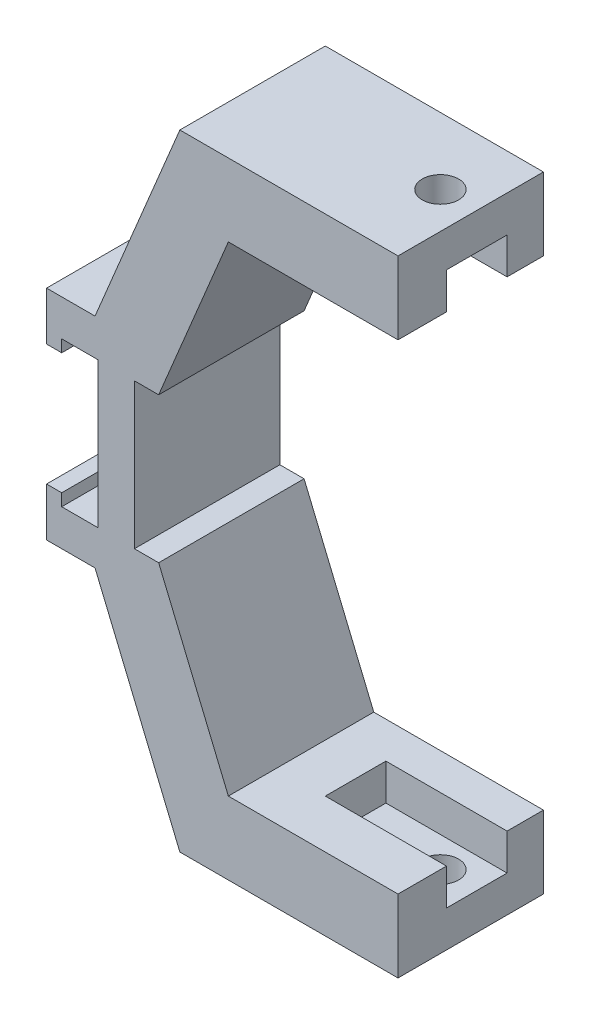
ISO-10303-21;
HEADER;
FILE_DESCRIPTION(('STEP AP214'),'2;1');
FILE_NAME('part.step','',(''),(''),'','','');
FILE_SCHEMA(('AUTOMOTIVE_DESIGN { 1 0 10303 214 1 1 1 1 }'));
ENDSEC;
DATA;
#1=APPLICATION_CONTEXT('core data for automotive mechanical design processes');
#2=APPLICATION_PROTOCOL_DEFINITION('international standard','automotive_design',2000,#1);
#3=PRODUCT_CONTEXT('',#1,'mechanical');
#4=PRODUCT('Part','Part','',(#3));
#5=PRODUCT_RELATED_PRODUCT_CATEGORY('part','',(#4));
#6=PRODUCT_DEFINITION_FORMATION('','',#4);
#7=PRODUCT_DEFINITION_CONTEXT('part definition',#1,'design');
#8=PRODUCT_DEFINITION('design','',#6,#7);
#9=PRODUCT_DEFINITION_SHAPE('','',#8);
#10=(LENGTH_UNIT() NAMED_UNIT(*) SI_UNIT(.MILLI.,.METRE.));
#11=(NAMED_UNIT(*) PLANE_ANGLE_UNIT() SI_UNIT($,.RADIAN.));
#12=(NAMED_UNIT(*) SI_UNIT($,.STERADIAN.) SOLID_ANGLE_UNIT());
#13=UNCERTAINTY_MEASURE_WITH_UNIT(LENGTH_MEASURE(1.E-05),#10,'distance_accuracy_value','');
#14=(GEOMETRIC_REPRESENTATION_CONTEXT(3) GLOBAL_UNCERTAINTY_ASSIGNED_CONTEXT((#13)) GLOBAL_UNIT_ASSIGNED_CONTEXT((#10,
#11,#12)) REPRESENTATION_CONTEXT('',''));
#15=CARTESIAN_POINT('',(0.,0.,0.));
#16=DIRECTION('',(0.,0.,1.));
#17=DIRECTION('',(1.,0.,0.));
#18=AXIS2_PLACEMENT_3D('',#15,#16,#17);
#19=CARTESIAN_POINT('',(8.96410514513844,-42.2697338281613,12.));
#20=DIRECTION('',(1.,0.,0.));
#21=DIRECTION('',(0.,0.,-1.));
#22=AXIS2_PLACEMENT_3D('',#19,#20,#21);
#23=PLANE('',#22);
#24=DIRECTION('',(0.,0.,1.));
#25=VECTOR('',#24,1.);
#26=CARTESIAN_POINT('',(8.96410514513844,-39.2697338281613,8.));
#27=LINE('',#26,#25);
#28=CARTESIAN_POINT('',(8.96410514513844,-39.2697338281613,3.));
#29=VERTEX_POINT('',#28);
#30=CARTESIAN_POINT('',(8.96410514513844,-39.2697338281613,8.));
#31=VERTEX_POINT('',#30);
#32=EDGE_CURVE('E267',#29,#31,#27,.T.);
#33=ORIENTED_EDGE('',*,*,#32,.T.);
#34=DIRECTION('',(0.,1.,0.));
#35=VECTOR('',#34,1.);
#36=CARTESIAN_POINT('',(8.96410514513844,-39.2697338281613,8.));
#37=LINE('',#36,#35);
#38=CARTESIAN_POINT('',(8.96410514513844,-36.2697338281613,8.));
#39=VERTEX_POINT('',#38);
#40=EDGE_CURVE('E258',#31,#39,#37,.T.);
#41=ORIENTED_EDGE('',*,*,#40,.T.);
#42=DIRECTION('',(0.,0.,-1.));
#43=VECTOR('',#42,1.);
#44=CARTESIAN_POINT('',(8.96410514513844,-36.2697338281613,12.));
#45=LINE('',#44,#43);
#46=CARTESIAN_POINT('',(8.96410514513844,-36.2697338281613,12.));
#47=VERTEX_POINT('',#46);
#48=EDGE_CURVE('E374',#47,#39,#45,.T.);
#49=ORIENTED_EDGE('',*,*,#48,.F.);
#50=DIRECTION('',(0.,-1.,0.));
#51=VECTOR('',#50,1.);
#52=CARTESIAN_POINT('',(8.96410514513844,-42.2697338281613,12.));
#53=LINE('',#52,#51);
#54=CARTESIAN_POINT('',(8.96410514513844,-42.2697338281613,12.));
#55=VERTEX_POINT('',#54);
#56=EDGE_CURVE('E284',#47,#55,#53,.T.);
#57=ORIENTED_EDGE('',*,*,#56,.T.);
#58=DIRECTION('',(0.,0.,-1.));
#59=VECTOR('',#58,1.);
#60=CARTESIAN_POINT('',(8.96410514513844,-42.2697338281613,12.));
#61=LINE('',#60,#59);
#62=CARTESIAN_POINT('',(8.96410514513844,-42.2697338281613,0.));
#63=VERTEX_POINT('',#62);
#64=EDGE_CURVE('E318',#55,#63,#61,.T.);
#65=ORIENTED_EDGE('',*,*,#64,.T.);
#66=DIRECTION('',(0.,-1.,0.));
#67=VECTOR('',#66,1.);
#68=CARTESIAN_POINT('',(8.96410514513844,-42.2697338281613,0.));
#69=LINE('',#68,#67);
#70=CARTESIAN_POINT('',(8.96410514513844,-36.2697338281613,0.));
#71=VERTEX_POINT('',#70);
#72=EDGE_CURVE('E279',#71,#63,#69,.T.);
#73=ORIENTED_EDGE('',*,*,#72,.F.);
#74=CARTESIAN_POINT('',(8.96410514513844,-36.2697338281613,3.));
#75=VERTEX_POINT('',#74);
#76=EDGE_CURVE('E373',#75,#71,#45,.T.);
#77=ORIENTED_EDGE('',*,*,#76,.F.);
#78=DIRECTION('',(0.,-1.,0.));
#79=VECTOR('',#78,1.);
#80=CARTESIAN_POINT('',(8.96410514513844,-39.2697338281613,3.));
#81=LINE('',#80,#79);
#82=EDGE_CURVE('E264',#75,#29,#81,.T.);
#83=ORIENTED_EDGE('',*,*,#82,.T.);
#84=EDGE_LOOP('',(#33,#41,#49,#57,#65,#73,#77,#83));
#85=FACE_BOUND('',#84,.T.);
#86=ADVANCED_FACE('F33',(#85),#23,.T.);
#87=CARTESIAN_POINT('',(8.96410514513844,-36.2697338281613,12.));
#88=DIRECTION('',(0.,1.,0.));
#89=DIRECTION('',(-1.,0.,0.));
#90=AXIS2_PLACEMENT_3D('',#87,#88,#89);
#91=PLANE('',#90);
#92=ORIENTED_EDGE('',*,*,#48,.T.);
#93=DIRECTION('',(1.,0.,0.));
#94=VECTOR('',#93,1.);
#95=CARTESIAN_POINT('',(-1.03589485486156,-36.2697338281613,8.));
#96=LINE('',#95,#94);
#97=CARTESIAN_POINT('',(-1.03589485486156,-36.2697338281613,8.));
#98=VERTEX_POINT('',#97);
#99=EDGE_CURVE('E277',#98,#39,#96,.T.);
#100=ORIENTED_EDGE('',*,*,#99,.F.);
#101=DIRECTION('',(0.,0.,-1.));
#102=VECTOR('',#101,1.);
#103=CARTESIAN_POINT('',(-1.03589485486156,-36.2697338281613,8.));
#104=LINE('',#103,#102);
#105=CARTESIAN_POINT('',(-1.03589485486156,-36.2697338281613,3.));
#106=VERTEX_POINT('',#105);
#107=EDGE_CURVE('E260',#98,#106,#104,.T.);
#108=ORIENTED_EDGE('',*,*,#107,.T.);
#109=DIRECTION('',(1.,0.,0.));
#110=VECTOR('',#109,1.);
#111=CARTESIAN_POINT('',(-1.03589485486156,-36.2697338281613,3.));
#112=LINE('',#111,#110);
#113=EDGE_CURVE('E280',#106,#75,#112,.T.);
#114=ORIENTED_EDGE('',*,*,#113,.T.);
#115=ORIENTED_EDGE('',*,*,#76,.T.);
#116=DIRECTION('',(1.,0.,0.));
#117=VECTOR('',#116,1.);
#118=CARTESIAN_POINT('',(8.96410514513844,-36.2697338281613,0.));
#119=LINE('',#118,#117);
#120=CARTESIAN_POINT('',(-5.03589485486156,-36.2697338281613,0.));
#121=VERTEX_POINT('',#120);
#122=EDGE_CURVE('E321',#121,#71,#119,.T.);
#123=ORIENTED_EDGE('',*,*,#122,.F.);
#124=DIRECTION('',(0.,0.,-1.));
#125=VECTOR('',#124,1.);
#126=CARTESIAN_POINT('',(-5.03589485486156,-36.2697338281613,12.));
#127=LINE('',#126,#125);
#128=CARTESIAN_POINT('',(-5.03589485486156,-36.2697338281613,12.));
#129=VERTEX_POINT('',#128);
#130=EDGE_CURVE('E371',#129,#121,#127,.T.);
#131=ORIENTED_EDGE('',*,*,#130,.F.);
#132=DIRECTION('',(1.,0.,0.));
#133=VECTOR('',#132,1.);
#134=CARTESIAN_POINT('',(8.96410514513844,-36.2697338281613,12.));
#135=LINE('',#134,#133);
#136=EDGE_CURVE('E287',#129,#47,#135,.T.);
#137=ORIENTED_EDGE('',*,*,#136,.T.);
#138=EDGE_LOOP('',(#92,#100,#108,#114,#115,#123,#131,#137));
#139=FACE_BOUND('',#138,.T.);
#140=ADVANCED_FACE('F558',(#139),#91,.T.);
#141=CARTESIAN_POINT('',(8.96410514513844,9.33026617183856,12.));
#142=DIRECTION('',(-1.,0.,0.));
#143=DIRECTION('',(0.,0.,1.));
#144=AXIS2_PLACEMENT_3D('',#141,#142,#143);
#145=PLANE('',#144);
#146=DIRECTION('',(0.,0.,-1.));
#147=VECTOR('',#146,1.);
#148=CARTESIAN_POINT('',(8.96410514513844,3.33026617183856,12.));
#149=LINE('',#148,#147);
#150=CARTESIAN_POINT('',(8.96410514513844,3.33026617183856,12.));
#151=VERTEX_POINT('',#150);
#152=CARTESIAN_POINT('',(8.96410514513844,3.33026617183858,8.));
#153=VERTEX_POINT('',#152);
#154=EDGE_CURVE('E464',#151,#153,#149,.T.);
#155=ORIENTED_EDGE('',*,*,#154,.T.);
#156=DIRECTION('',(0.,-1.,0.));
#157=VECTOR('',#156,1.);
#158=CARTESIAN_POINT('',(8.96410514513844,6.33026617183858,8.));
#159=LINE('',#158,#157);
#160=CARTESIAN_POINT('',(8.96410514513844,6.33026617183858,8.));
#161=VERTEX_POINT('',#160);
#162=EDGE_CURVE('E383',#161,#153,#159,.T.);
#163=ORIENTED_EDGE('',*,*,#162,.F.);
#164=DIRECTION('',(0.,0.,1.));
#165=VECTOR('',#164,1.);
#166=CARTESIAN_POINT('',(8.96410514513844,6.33026617183858,8.));
#167=LINE('',#166,#165);
#168=CARTESIAN_POINT('',(8.96410514513844,6.33026617183858,3.));
#169=VERTEX_POINT('',#168);
#170=EDGE_CURVE('E386',#169,#161,#167,.T.);
#171=ORIENTED_EDGE('',*,*,#170,.F.);
#172=DIRECTION('',(0.,1.,0.));
#173=VECTOR('',#172,1.);
#174=CARTESIAN_POINT('',(8.96410514513844,6.33026617183858,3.));
#175=LINE('',#174,#173);
#176=CARTESIAN_POINT('',(8.96410514513844,3.33026617183858,3.));
#177=VERTEX_POINT('',#176);
#178=EDGE_CURVE('E395',#177,#169,#175,.T.);
#179=ORIENTED_EDGE('',*,*,#178,.F.);
#180=CARTESIAN_POINT('',(8.96410514513844,3.33026617183856,0.));
#181=VERTEX_POINT('',#180);
#182=EDGE_CURVE('E437',#177,#181,#149,.T.);
#183=ORIENTED_EDGE('',*,*,#182,.T.);
#184=DIRECTION('',(0.,1.,0.));
#185=VECTOR('',#184,1.);
#186=CARTESIAN_POINT('',(8.96410514513844,9.33026617183856,0.));
#187=LINE('',#186,#185);
#188=CARTESIAN_POINT('',(8.96410514513844,9.33026617183856,0.));
#189=VERTEX_POINT('',#188);
#190=EDGE_CURVE('E402',#181,#189,#187,.T.);
#191=ORIENTED_EDGE('',*,*,#190,.T.);
#192=DIRECTION('',(0.,0.,-1.));
#193=VECTOR('',#192,1.);
#194=CARTESIAN_POINT('',(8.96410514513844,9.33026617183856,12.));
#195=LINE('',#194,#193);
#196=CARTESIAN_POINT('',(8.96410514513844,9.33026617183856,12.));
#197=VERTEX_POINT('',#196);
#198=EDGE_CURVE('E11',#197,#189,#195,.T.);
#199=ORIENTED_EDGE('',*,*,#198,.F.);
#200=DIRECTION('',(0.,1.,0.));
#201=VECTOR('',#200,1.);
#202=CARTESIAN_POINT('',(8.96410514513844,9.33026617183856,12.));
#203=LINE('',#202,#201);
#204=EDGE_CURVE('E409',#151,#197,#203,.T.);
#205=ORIENTED_EDGE('',*,*,#204,.F.);
#206=EDGE_LOOP('',(#155,#163,#171,#179,#183,#191,#199,#205));
#207=FACE_BOUND('',#206,.T.);
#208=ADVANCED_FACE('F35',(#207),#145,.F.);
#209=CARTESIAN_POINT('',(8.96410514513844,9.33026617183856,12.));
#210=DIRECTION('',(0.,-1.,0.));
#211=DIRECTION('',(0.,0.,-1.));
#212=AXIS2_PLACEMENT_3D('',#209,#210,#211);
#213=PLANE('',#212);
#214=CARTESIAN_POINT('',(5.96410514513844,9.33026617183856,5.5));
#215=DIRECTION('',(0.,1.,0.));
#216=DIRECTION('',(-1.,0.,0.));
#217=AXIS2_PLACEMENT_3D('',#214,#215,#216);
#218=CIRCLE('',#217,1.5);
#219=CARTESIAN_POINT('',(4.46410514513844,9.33026617183856,5.5));
#220=VERTEX_POINT('',#219);
#221=EDGE_CURVE('E377',#220,#220,#218,.T.);
#222=ORIENTED_EDGE('',*,*,#221,.F.);
#223=EDGE_LOOP('',(#222));
#224=FACE_BOUND('',#223,.T.);
#225=DIRECTION('',(-1.,0.,0.));
#226=VECTOR('',#225,1.);
#227=CARTESIAN_POINT('',(8.96410514513844,9.33026617183856,0.));
#228=LINE('',#227,#226);
#229=CARTESIAN_POINT('',(-9.03589485486156,9.33026617183856,0.));
#230=VERTEX_POINT('',#229);
#231=EDGE_CURVE('E440',#189,#230,#228,.T.);
#232=ORIENTED_EDGE('',*,*,#231,.T.);
#233=DIRECTION('',(0.,0.,-1.));
#234=VECTOR('',#233,1.);
#235=CARTESIAN_POINT('',(-9.03589485486156,9.33026617183856,12.));
#236=LINE('',#235,#234);
#237=CARTESIAN_POINT('',(-9.03589485486156,9.33026617183856,12.));
#238=VERTEX_POINT('',#237);
#239=EDGE_CURVE('E41',#238,#230,#236,.T.);
#240=ORIENTED_EDGE('',*,*,#239,.F.);
#241=DIRECTION('',(-1.,0.,0.));
#242=VECTOR('',#241,1.);
#243=CARTESIAN_POINT('',(8.96410514513844,9.33026617183856,12.));
#244=LINE('',#243,#242);
#245=EDGE_CURVE('E412',#197,#238,#244,.T.);
#246=ORIENTED_EDGE('',*,*,#245,.F.);
#247=ORIENTED_EDGE('',*,*,#198,.T.);
#248=EDGE_LOOP('',(#232,#240,#246,#247));
#249=FACE_BOUND('',#248,.T.);
#250=ADVANCED_FACE('F521',(#224,#249),#213,.F.);
#251=CARTESIAN_POINT('',(-9.03589485486156,9.33026617183856,12.));
#252=DIRECTION('',(0.923076923076922,-0.384615384615386,0.));
#253=DIRECTION('',(0.384615384615386,0.923076923076923,0.));
#254=AXIS2_PLACEMENT_3D('',#251,#252,#253);
#255=PLANE('',#254);
#256=DIRECTION('',(-0.384615384615386,-0.923076923076923,0.));
#257=VECTOR('',#256,1.);
#258=CARTESIAN_POINT('',(-9.03589485486156,9.33026617183856,0.));
#259=LINE('',#258,#257);
#260=CARTESIAN_POINT('',(-16.0358948548616,-7.46973382816139,0.));
#261=VERTEX_POINT('',#260);
#262=EDGE_CURVE('E442',#230,#261,#259,.T.);
#263=ORIENTED_EDGE('',*,*,#262,.T.);
#264=DIRECTION('',(0.,0.,-1.));
#265=VECTOR('',#264,1.);
#266=CARTESIAN_POINT('',(-16.0358948548616,-7.46973382816139,12.));
#267=LINE('',#266,#265);
#268=CARTESIAN_POINT('',(-16.0358948548616,-7.46973382816139,12.));
#269=VERTEX_POINT('',#268);
#270=EDGE_CURVE('E491',#269,#261,#267,.T.);
#271=ORIENTED_EDGE('',*,*,#270,.F.);
#272=DIRECTION('',(-0.384615384615386,-0.923076923076923,0.));
#273=VECTOR('',#272,1.);
#274=CARTESIAN_POINT('',(-9.03589485486156,9.33026617183856,12.));
#275=LINE('',#274,#273);
#276=EDGE_CURVE('E415',#238,#269,#275,.T.);
#277=ORIENTED_EDGE('',*,*,#276,.F.);
#278=ORIENTED_EDGE('',*,*,#239,.T.);
#279=EDGE_LOOP('',(#263,#271,#277,#278));
#280=FACE_BOUND('',#279,.T.);
#281=ADVANCED_FACE('F498',(#280),#255,.F.);
#282=CARTESIAN_POINT('',(-16.0358948548616,-7.46973382816139,12.));
#283=DIRECTION('',(0.,-1.,0.));
#284=DIRECTION('',(1.,0.,0.));
#285=AXIS2_PLACEMENT_3D('',#282,#283,#284);
#286=PLANE('',#285);
#287=DIRECTION('',(-1.,0.,0.));
#288=VECTOR('',#287,1.);
#289=CARTESIAN_POINT('',(-16.0358948548616,-7.46973382816139,0.));
#290=LINE('',#289,#288);
#291=CARTESIAN_POINT('',(-20.0358948548616,-7.46973382816139,0.));
#292=VERTEX_POINT('',#291);
#293=EDGE_CURVE('E444',#261,#292,#290,.T.);
#294=ORIENTED_EDGE('',*,*,#293,.T.);
#295=DIRECTION('',(0.,0.,-1.));
#296=VECTOR('',#295,1.);
#297=CARTESIAN_POINT('',(-20.0358948548616,-7.46973382816139,12.));
#298=LINE('',#297,#296);
#299=CARTESIAN_POINT('',(-20.0358948548616,-7.46973382816139,12.));
#300=VERTEX_POINT('',#299);
#301=EDGE_CURVE('E488',#300,#292,#298,.T.);
#302=ORIENTED_EDGE('',*,*,#301,.F.);
#303=DIRECTION('',(-1.,0.,0.));
#304=VECTOR('',#303,1.);
#305=CARTESIAN_POINT('',(-16.0358948548616,-7.46973382816139,12.));
#306=LINE('',#305,#304);
#307=EDGE_CURVE('E417',#269,#300,#306,.T.);
#308=ORIENTED_EDGE('',*,*,#307,.F.);
#309=ORIENTED_EDGE('',*,*,#270,.T.);
#310=EDGE_LOOP('',(#294,#302,#308,#309));
#311=FACE_BOUND('',#310,.T.);
#312=ADVANCED_FACE('F509',(#311),#286,.F.);
#313=CARTESIAN_POINT('',(-20.0358948548616,-7.46973382816139,12.));
#314=DIRECTION('',(1.,0.,0.));
#315=DIRECTION('',(0.,0.,-1.));
#316=AXIS2_PLACEMENT_3D('',#313,#314,#315);
#317=PLANE('',#316);
#318=DIRECTION('',(0.,-1.,0.));
#319=VECTOR('',#318,1.);
#320=CARTESIAN_POINT('',(-20.0358948548616,-7.46973382816139,0.));
#321=LINE('',#320,#319);
#322=CARTESIAN_POINT('',(-20.0358948548616,-11.4697338281614,0.));
#323=VERTEX_POINT('',#322);
#324=EDGE_CURVE('E446',#292,#323,#321,.T.);
#325=ORIENTED_EDGE('',*,*,#324,.T.);
#326=DIRECTION('',(0.,0.,-1.));
#327=VECTOR('',#326,1.);
#328=CARTESIAN_POINT('',(-20.0358948548616,-11.4697338281614,12.));
#329=LINE('',#328,#327);
#330=CARTESIAN_POINT('',(-20.0358948548616,-11.4697338281614,12.));
#331=VERTEX_POINT('',#330);
#332=EDGE_CURVE('E485',#331,#323,#329,.T.);
#333=ORIENTED_EDGE('',*,*,#332,.F.);
#334=DIRECTION('',(0.,-1.,0.));
#335=VECTOR('',#334,1.);
#336=CARTESIAN_POINT('',(-20.0358948548616,-7.46973382816139,12.));
#337=LINE('',#336,#335);
#338=EDGE_CURVE('E419',#300,#331,#337,.T.);
#339=ORIENTED_EDGE('',*,*,#338,.F.);
#340=ORIENTED_EDGE('',*,*,#301,.T.);
#341=EDGE_LOOP('',(#325,#333,#339,#340));
#342=FACE_BOUND('',#341,.T.);
#343=ADVANCED_FACE('F513',(#342),#317,.F.);
#344=CARTESIAN_POINT('',(-20.0358948548616,-11.4697338281614,12.));
#345=DIRECTION('',(0.,1.,0.));
#346=DIRECTION('',(0.,0.,1.));
#347=AXIS2_PLACEMENT_3D('',#344,#345,#346);
#348=PLANE('',#347);
#349=DIRECTION('',(1.,0.,0.));
#350=VECTOR('',#349,1.);
#351=CARTESIAN_POINT('',(-20.0358948548616,-11.4697338281614,0.));
#352=LINE('',#351,#350);
#353=CARTESIAN_POINT('',(-18.7858948548615,-11.4697338281614,0.));
#354=VERTEX_POINT('',#353);
#355=EDGE_CURVE('E448',#323,#354,#352,.T.);
#356=ORIENTED_EDGE('',*,*,#355,.T.);
#357=DIRECTION('',(0.,0.,-1.));
#358=VECTOR('',#357,1.);
#359=CARTESIAN_POINT('',(-18.7858948548615,-11.4697338281614,12.));
#360=LINE('',#359,#358);
#361=CARTESIAN_POINT('',(-18.7858948548615,-11.4697338281614,12.));
#362=VERTEX_POINT('',#361);
#363=EDGE_CURVE('E482',#362,#354,#360,.T.);
#364=ORIENTED_EDGE('',*,*,#363,.F.);
#365=DIRECTION('',(1.,0.,0.));
#366=VECTOR('',#365,1.);
#367=CARTESIAN_POINT('',(-20.0358948548616,-11.4697338281614,12.));
#368=LINE('',#367,#366);
#369=EDGE_CURVE('E421',#331,#362,#368,.T.);
#370=ORIENTED_EDGE('',*,*,#369,.F.);
#371=ORIENTED_EDGE('',*,*,#332,.T.);
#372=EDGE_LOOP('',(#356,#364,#370,#371));
#373=FACE_BOUND('',#372,.T.);
#374=ADVANCED_FACE('F606',(#373),#348,.F.);
#375=CARTESIAN_POINT('',(-18.7858948548615,-11.4697338281614,12.));
#376=DIRECTION('',(-1.,0.,0.));
#377=DIRECTION('',(0.,-1.,0.));
#378=AXIS2_PLACEMENT_3D('',#375,#376,#377);
#379=PLANE('',#378);
#380=DIRECTION('',(0.,1.,0.));
#381=VECTOR('',#380,1.);
#382=CARTESIAN_POINT('',(-18.7858948548615,-11.4697338281614,0.));
#383=LINE('',#382,#381);
#384=CARTESIAN_POINT('',(-18.7858948548616,-10.4697338281614,0.));
#385=VERTEX_POINT('',#384);
#386=EDGE_CURVE('E450',#354,#385,#383,.T.);
#387=ORIENTED_EDGE('',*,*,#386,.T.);
#388=DIRECTION('',(0.,0.,-1.));
#389=VECTOR('',#388,1.);
#390=CARTESIAN_POINT('',(-18.7858948548616,-10.4697338281614,12.));
#391=LINE('',#390,#389);
#392=CARTESIAN_POINT('',(-18.7858948548616,-10.4697338281614,12.));
#393=VERTEX_POINT('',#392);
#394=EDGE_CURVE('E479',#393,#385,#391,.T.);
#395=ORIENTED_EDGE('',*,*,#394,.F.);
#396=DIRECTION('',(0.,1.,0.));
#397=VECTOR('',#396,1.);
#398=CARTESIAN_POINT('',(-18.7858948548615,-11.4697338281614,12.));
#399=LINE('',#398,#397);
#400=EDGE_CURVE('E423',#362,#393,#399,.T.);
#401=ORIENTED_EDGE('',*,*,#400,.F.);
#402=ORIENTED_EDGE('',*,*,#363,.T.);
#403=EDGE_LOOP('',(#387,#395,#401,#402));
#404=FACE_BOUND('',#403,.T.);
#405=ADVANCED_FACE('F604',(#404),#379,.F.);
#406=CARTESIAN_POINT('',(-18.7858948548616,-10.4697338281614,12.));
#407=DIRECTION('',(0.,1.,0.));
#408=DIRECTION('',(0.,0.,1.));
#409=AXIS2_PLACEMENT_3D('',#406,#407,#408);
#410=PLANE('',#409);
#411=DIRECTION('',(1.,0.,0.));
#412=VECTOR('',#411,1.);
#413=CARTESIAN_POINT('',(-18.7858948548616,-10.4697338281614,0.));
#414=LINE('',#413,#412);
#415=CARTESIAN_POINT('',(-15.7858948548616,-10.4697338281614,0.));
#416=VERTEX_POINT('',#415);
#417=EDGE_CURVE('E452',#385,#416,#414,.T.);
#418=ORIENTED_EDGE('',*,*,#417,.T.);
#419=DIRECTION('',(0.,0.,-1.));
#420=VECTOR('',#419,1.);
#421=CARTESIAN_POINT('',(-15.7858948548616,-10.4697338281614,12.));
#422=LINE('',#421,#420);
#423=CARTESIAN_POINT('',(-15.7858948548616,-10.4697338281614,12.));
#424=VERTEX_POINT('',#423);
#425=EDGE_CURVE('E476',#424,#416,#422,.T.);
#426=ORIENTED_EDGE('',*,*,#425,.F.);
#427=DIRECTION('',(1.,0.,0.));
#428=VECTOR('',#427,1.);
#429=CARTESIAN_POINT('',(-18.7858948548616,-10.4697338281614,12.));
#430=LINE('',#429,#428);
#431=EDGE_CURVE('E425',#393,#424,#430,.T.);
#432=ORIENTED_EDGE('',*,*,#431,.F.);
#433=ORIENTED_EDGE('',*,*,#394,.T.);
#434=EDGE_LOOP('',(#418,#426,#432,#433));
#435=FACE_BOUND('',#434,.T.);
#436=ADVANCED_FACE('F600',(#435),#410,.F.);
#437=CARTESIAN_POINT('',(-15.7858948548616,-10.4697338281614,12.));
#438=DIRECTION('',(1.,0.,0.));
#439=DIRECTION('',(0.,0.,-1.));
#440=AXIS2_PLACEMENT_3D('',#437,#438,#439);
#441=PLANE('',#440);
#442=DIRECTION('',(0.,-1.,0.));
#443=VECTOR('',#442,1.);
#444=CARTESIAN_POINT('',(-15.7858948548616,-10.4697338281614,0.));
#445=LINE('',#444,#443);
#446=CARTESIAN_POINT('',(-15.7858948548616,-22.4697338281614,0.));
#447=VERTEX_POINT('',#446);
#448=EDGE_CURVE('E454',#416,#447,#445,.T.);
#449=ORIENTED_EDGE('',*,*,#448,.T.);
#450=DIRECTION('',(0.,0.,-1.));
#451=VECTOR('',#450,1.);
#452=CARTESIAN_POINT('',(-15.7858948548616,-22.4697338281614,12.));
#453=LINE('',#452,#451);
#454=CARTESIAN_POINT('',(-15.7858948548616,-22.4697338281614,12.));
#455=VERTEX_POINT('',#454);
#456=EDGE_CURVE('E363',#455,#447,#453,.T.);
#457=ORIENTED_EDGE('',*,*,#456,.F.);
#458=DIRECTION('',(0.,-1.,0.));
#459=VECTOR('',#458,1.);
#460=CARTESIAN_POINT('',(-15.7858948548616,-10.4697338281614,12.));
#461=LINE('',#460,#459);
#462=EDGE_CURVE('E427',#424,#455,#461,.T.);
#463=ORIENTED_EDGE('',*,*,#462,.F.);
#464=ORIENTED_EDGE('',*,*,#425,.T.);
#465=EDGE_LOOP('',(#449,#457,#463,#464));
#466=FACE_BOUND('',#465,.T.);
#467=ADVANCED_FACE('F595',(#466),#441,.F.);
#468=CARTESIAN_POINT('',(-12.7858948548616,-10.4697338281614,12.));
#469=DIRECTION('',(-1.,0.,0.));
#470=DIRECTION('',(0.,0.,1.));
#471=AXIS2_PLACEMENT_3D('',#468,#469,#470);
#472=PLANE('',#471);
#473=DIRECTION('',(0.,1.,0.));
#474=VECTOR('',#473,1.);
#475=CARTESIAN_POINT('',(-12.7858948548616,-10.4697338281614,0.));
#476=LINE('',#475,#474);
#477=CARTESIAN_POINT('',(-12.7858948548616,-22.4697338281614,0.));
#478=VERTEX_POINT('',#477);
#479=CARTESIAN_POINT('',(-12.7858948548616,-10.4697338281614,0.));
#480=VERTEX_POINT('',#479);
#481=EDGE_CURVE('E456',#478,#480,#476,.T.);
#482=ORIENTED_EDGE('',*,*,#481,.T.);
#483=DIRECTION('',(0.,0.,-1.));
#484=VECTOR('',#483,1.);
#485=CARTESIAN_POINT('',(-12.7858948548616,-10.4697338281614,12.));
#486=LINE('',#485,#484);
#487=CARTESIAN_POINT('',(-12.7858948548616,-10.4697338281614,12.));
#488=VERTEX_POINT('',#487);
#489=EDGE_CURVE('E473',#488,#480,#486,.T.);
#490=ORIENTED_EDGE('',*,*,#489,.F.);
#491=DIRECTION('',(0.,1.,0.));
#492=VECTOR('',#491,1.);
#493=CARTESIAN_POINT('',(-12.7858948548616,-10.4697338281614,12.));
#494=LINE('',#493,#492);
#495=CARTESIAN_POINT('',(-12.7858948548616,-22.4697338281614,12.));
#496=VERTEX_POINT('',#495);
#497=EDGE_CURVE('E429',#496,#488,#494,.T.);
#498=ORIENTED_EDGE('',*,*,#497,.F.);
#499=DIRECTION('',(0.,0.,-1.));
#500=VECTOR('',#499,1.);
#501=CARTESIAN_POINT('',(-12.7858948548616,-22.4697338281614,12.));
#502=LINE('',#501,#500);
#503=EDGE_CURVE('E366',#496,#478,#502,.T.);
#504=ORIENTED_EDGE('',*,*,#503,.T.);
#505=EDGE_LOOP('',(#482,#490,#498,#504));
#506=FACE_BOUND('',#505,.T.);
#507=ADVANCED_FACE('F546',(#506),#472,.F.);
#508=CARTESIAN_POINT('',(-12.7858948548616,-10.4697338281614,12.));
#509=DIRECTION('',(0.,1.,0.));
#510=DIRECTION('',(-1.,0.,0.));
#511=AXIS2_PLACEMENT_3D('',#508,#509,#510);
#512=PLANE('',#511);
#513=DIRECTION('',(1.,0.,0.));
#514=VECTOR('',#513,1.);
#515=CARTESIAN_POINT('',(-12.7858948548616,-10.4697338281614,0.));
#516=LINE('',#515,#514);
#517=CARTESIAN_POINT('',(-10.7858948548616,-10.4697338281614,0.));
#518=VERTEX_POINT('',#517);
#519=EDGE_CURVE('E458',#480,#518,#516,.T.);
#520=ORIENTED_EDGE('',*,*,#519,.T.);
#521=DIRECTION('',(0.,0.,-1.));
#522=VECTOR('',#521,1.);
#523=CARTESIAN_POINT('',(-10.7858948548616,-10.4697338281614,12.));
#524=LINE('',#523,#522);
#525=CARTESIAN_POINT('',(-10.7858948548616,-10.4697338281614,12.));
#526=VERTEX_POINT('',#525);
#527=EDGE_CURVE('E470',#526,#518,#524,.T.);
#528=ORIENTED_EDGE('',*,*,#527,.F.);
#529=DIRECTION('',(1.,0.,0.));
#530=VECTOR('',#529,1.);
#531=CARTESIAN_POINT('',(-12.7858948548616,-10.4697338281614,12.));
#532=LINE('',#531,#530);
#533=EDGE_CURVE('E431',#488,#526,#532,.T.);
#534=ORIENTED_EDGE('',*,*,#533,.F.);
#535=ORIENTED_EDGE('',*,*,#489,.T.);
#536=EDGE_LOOP('',(#520,#528,#534,#535));
#537=FACE_BOUND('',#536,.T.);
#538=ADVANCED_FACE('F541',(#537),#512,.F.);
#539=CARTESIAN_POINT('',(-10.7858948548616,-10.4697338281614,12.));
#540=DIRECTION('',(-0.923076923076923,0.384615384615386,0.));
#541=DIRECTION('',(-0.384615384615386,-0.923076923076923,0.));
#542=AXIS2_PLACEMENT_3D('',#539,#540,#541);
#543=PLANE('',#542);
#544=DIRECTION('',(0.384615384615386,0.923076923076923,0.));
#545=VECTOR('',#544,1.);
#546=CARTESIAN_POINT('',(-10.7858948548616,-10.4697338281614,0.));
#547=LINE('',#546,#545);
#548=CARTESIAN_POINT('',(-5.03589485486156,3.33026617183855,0.));
#549=VERTEX_POINT('',#548);
#550=EDGE_CURVE('E460',#518,#549,#547,.T.);
#551=ORIENTED_EDGE('',*,*,#550,.T.);
#552=DIRECTION('',(0.,0.,-1.));
#553=VECTOR('',#552,1.);
#554=CARTESIAN_POINT('',(-5.03589485486156,3.33026617183855,12.));
#555=LINE('',#554,#553);
#556=CARTESIAN_POINT('',(-5.03589485486156,3.33026617183855,12.));
#557=VERTEX_POINT('',#556);
#558=EDGE_CURVE('E467',#557,#549,#555,.T.);
#559=ORIENTED_EDGE('',*,*,#558,.F.);
#560=DIRECTION('',(0.384615384615386,0.923076923076923,0.));
#561=VECTOR('',#560,1.);
#562=CARTESIAN_POINT('',(-10.7858948548616,-10.4697338281614,12.));
#563=LINE('',#562,#561);
#564=EDGE_CURVE('E433',#526,#557,#563,.T.);
#565=ORIENTED_EDGE('',*,*,#564,.F.);
#566=ORIENTED_EDGE('',*,*,#527,.T.);
#567=EDGE_LOOP('',(#551,#559,#565,#566));
#568=FACE_BOUND('',#567,.T.);
#569=ADVANCED_FACE('F537',(#568),#543,.F.);
#570=CARTESIAN_POINT('',(8.96410514513844,3.33026617183856,12.));
#571=DIRECTION('',(0.,1.,0.));
#572=DIRECTION('',(-1.,0.,0.));
#573=AXIS2_PLACEMENT_3D('',#570,#571,#572);
#574=PLANE('',#573);
#575=DIRECTION('',(0.,0.,-1.));
#576=VECTOR('',#575,1.);
#577=CARTESIAN_POINT('',(-1.03589485486156,3.33026617183858,8.));
#578=LINE('',#577,#576);
#579=CARTESIAN_POINT('',(-1.03589485486156,3.33026617183855,8.));
#580=VERTEX_POINT('',#579);
#581=CARTESIAN_POINT('',(-1.03589485486156,3.33026617183858,3.));
#582=VERTEX_POINT('',#581);
#583=EDGE_CURVE('E385',#580,#582,#578,.T.);
#584=ORIENTED_EDGE('',*,*,#583,.F.);
#585=DIRECTION('',(1.,0.,0.));
#586=VECTOR('',#585,1.);
#587=CARTESIAN_POINT('',(-1.03589485486156,3.33026617183858,8.));
#588=LINE('',#587,#586);
#589=EDGE_CURVE('E393',#580,#153,#588,.T.);
#590=ORIENTED_EDGE('',*,*,#589,.T.);
#591=ORIENTED_EDGE('',*,*,#154,.F.);
#592=DIRECTION('',(1.,0.,0.));
#593=VECTOR('',#592,1.);
#594=CARTESIAN_POINT('',(8.96410514513844,3.33026617183856,12.));
#595=LINE('',#594,#593);
#596=EDGE_CURVE('E435',#557,#151,#595,.T.);
#597=ORIENTED_EDGE('',*,*,#596,.F.);
#598=ORIENTED_EDGE('',*,*,#558,.T.);
#599=DIRECTION('',(1.,0.,0.));
#600=VECTOR('',#599,1.);
#601=CARTESIAN_POINT('',(8.96410514513844,3.33026617183856,0.));
#602=LINE('',#601,#600);
#603=EDGE_CURVE('E413',#549,#181,#602,.T.);
#604=ORIENTED_EDGE('',*,*,#603,.T.);
#605=ORIENTED_EDGE('',*,*,#182,.F.);
#606=DIRECTION('',(1.,0.,0.));
#607=VECTOR('',#606,1.);
#608=CARTESIAN_POINT('',(-1.03589485486156,3.33026617183858,3.));
#609=LINE('',#608,#607);
#610=EDGE_CURVE('E405',#582,#177,#609,.T.);
#611=ORIENTED_EDGE('',*,*,#610,.F.);
#612=EDGE_LOOP('',(#584,#590,#591,#597,#598,#604,#605,#611));
#613=FACE_BOUND('',#612,.T.);
#614=ADVANCED_FACE('F530',(#613),#574,.F.);
#615=CARTESIAN_POINT('',(0.,0.,12.));
#616=DIRECTION('',(0.,0.,-1.));
#617=DIRECTION('',(-1.,0.,0.));
#618=AXIS2_PLACEMENT_3D('',#615,#616,#617);
#619=PLANE('',#618);
#620=ORIENTED_EDGE('',*,*,#204,.T.);
#621=ORIENTED_EDGE('',*,*,#245,.T.);
#622=ORIENTED_EDGE('',*,*,#276,.T.);
#623=ORIENTED_EDGE('',*,*,#307,.T.);
#624=ORIENTED_EDGE('',*,*,#338,.T.);
#625=ORIENTED_EDGE('',*,*,#369,.T.);
#626=ORIENTED_EDGE('',*,*,#400,.T.);
#627=ORIENTED_EDGE('',*,*,#431,.T.);
#628=ORIENTED_EDGE('',*,*,#462,.T.);
#629=DIRECTION('',(1.,0.,0.));
#630=VECTOR('',#629,1.);
#631=CARTESIAN_POINT('',(-18.7858948548616,-22.4697338281614,12.));
#632=LINE('',#631,#630);
#633=CARTESIAN_POINT('',(-18.7858948548616,-22.4697338281614,12.));
#634=VERTEX_POINT('',#633);
#635=EDGE_CURVE('E297',#634,#455,#632,.T.);
#636=ORIENTED_EDGE('',*,*,#635,.F.);
#637=DIRECTION('',(0.,-1.,0.));
#638=VECTOR('',#637,1.);
#639=CARTESIAN_POINT('',(-18.7858948548615,-21.4697338281614,12.));
#640=LINE('',#639,#638);
#641=CARTESIAN_POINT('',(-18.7858948548615,-21.4697338281614,12.));
#642=VERTEX_POINT('',#641);
#643=EDGE_CURVE('E300',#642,#634,#640,.T.);
#644=ORIENTED_EDGE('',*,*,#643,.F.);
#645=DIRECTION('',(1.,0.,0.));
#646=VECTOR('',#645,1.);
#647=CARTESIAN_POINT('',(-20.0358948548616,-21.4697338281614,12.));
#648=LINE('',#647,#646);
#649=CARTESIAN_POINT('',(-20.0358948548616,-21.4697338281614,12.));
#650=VERTEX_POINT('',#649);
#651=EDGE_CURVE('E303',#650,#642,#648,.T.);
#652=ORIENTED_EDGE('',*,*,#651,.F.);
#653=DIRECTION('',(0.,1.,0.));
#654=VECTOR('',#653,1.);
#655=CARTESIAN_POINT('',(-20.0358948548616,-25.4697338281614,12.));
#656=LINE('',#655,#654);
#657=CARTESIAN_POINT('',(-20.0358948548616,-25.4697338281614,12.));
#658=VERTEX_POINT('',#657);
#659=EDGE_CURVE('E306',#658,#650,#656,.T.);
#660=ORIENTED_EDGE('',*,*,#659,.F.);
#661=DIRECTION('',(-1.,0.,0.));
#662=VECTOR('',#661,1.);
#663=CARTESIAN_POINT('',(-16.0358948548616,-25.4697338281614,12.));
#664=LINE('',#663,#662);
#665=CARTESIAN_POINT('',(-16.0358948548616,-25.4697338281614,12.));
#666=VERTEX_POINT('',#665);
#667=EDGE_CURVE('E309',#666,#658,#664,.T.);
#668=ORIENTED_EDGE('',*,*,#667,.F.);
#669=DIRECTION('',(-0.384615384615386,0.923076923076923,0.));
#670=VECTOR('',#669,1.);
#671=CARTESIAN_POINT('',(-9.03589485486156,-42.2697338281613,12.));
#672=LINE('',#671,#670);
#673=CARTESIAN_POINT('',(-9.03589485486156,-42.2697338281613,12.));
#674=VERTEX_POINT('',#673);
#675=EDGE_CURVE('E312',#674,#666,#672,.T.);
#676=ORIENTED_EDGE('',*,*,#675,.F.);
#677=DIRECTION('',(-1.,0.,0.));
#678=VECTOR('',#677,1.);
#679=CARTESIAN_POINT('',(8.96410514513844,-42.2697338281613,12.));
#680=LINE('',#679,#678);
#681=EDGE_CURVE('E315',#55,#674,#680,.T.);
#682=ORIENTED_EDGE('',*,*,#681,.F.);
#683=ORIENTED_EDGE('',*,*,#56,.F.);
#684=ORIENTED_EDGE('',*,*,#136,.F.);
#685=DIRECTION('',(0.384615384615386,-0.923076923076923,0.));
#686=VECTOR('',#685,1.);
#687=CARTESIAN_POINT('',(-10.7858948548616,-22.4697338281614,12.));
#688=LINE('',#687,#686);
#689=CARTESIAN_POINT('',(-10.7858948548616,-22.4697338281614,12.));
#690=VERTEX_POINT('',#689);
#691=EDGE_CURVE('E291',#690,#129,#688,.T.);
#692=ORIENTED_EDGE('',*,*,#691,.F.);
#693=DIRECTION('',(1.,0.,0.));
#694=VECTOR('',#693,1.);
#695=CARTESIAN_POINT('',(-12.7858948548616,-22.4697338281614,12.));
#696=LINE('',#695,#694);
#697=EDGE_CURVE('E294',#496,#690,#696,.T.);
#698=ORIENTED_EDGE('',*,*,#697,.F.);
#699=ORIENTED_EDGE('',*,*,#497,.T.);
#700=ORIENTED_EDGE('',*,*,#533,.T.);
#701=ORIENTED_EDGE('',*,*,#564,.T.);
#702=ORIENTED_EDGE('',*,*,#596,.T.);
#703=EDGE_LOOP('',(#620,#621,#622,#623,#624,#625,#626,#627,#628,#636,#644,#652,#660,#668,#676,
#682,#683,#684,#692,#698,#699,#700,#701,#702));
#704=FACE_BOUND('',#703,.T.);
#705=ADVANCED_FACE('F517',(#704),#619,.F.);
#706=CARTESIAN_POINT('',(0.,0.,0.));
#707=DIRECTION('',(0.,0.,-1.));
#708=DIRECTION('',(-1.,0.,0.));
#709=AXIS2_PLACEMENT_3D('',#706,#707,#708);
#710=PLANE('',#709);
#711=ORIENTED_EDGE('',*,*,#190,.F.);
#712=ORIENTED_EDGE('',*,*,#603,.F.);
#713=ORIENTED_EDGE('',*,*,#550,.F.);
#714=ORIENTED_EDGE('',*,*,#519,.F.);
#715=ORIENTED_EDGE('',*,*,#481,.F.);
#716=DIRECTION('',(1.,0.,0.));
#717=VECTOR('',#716,1.);
#718=CARTESIAN_POINT('',(-12.7858948548616,-22.4697338281614,0.));
#719=LINE('',#718,#717);
#720=CARTESIAN_POINT('',(-10.7858948548616,-22.4697338281614,0.));
#721=VERTEX_POINT('',#720);
#722=EDGE_CURVE('E327',#478,#721,#719,.T.);
#723=ORIENTED_EDGE('',*,*,#722,.T.);
#724=DIRECTION('',(0.384615384615386,-0.923076923076923,0.));
#725=VECTOR('',#724,1.);
#726=CARTESIAN_POINT('',(-10.7858948548616,-22.4697338281614,0.));
#727=LINE('',#726,#725);
#728=EDGE_CURVE('E324',#721,#121,#727,.T.);
#729=ORIENTED_EDGE('',*,*,#728,.T.);
#730=ORIENTED_EDGE('',*,*,#122,.T.);
#731=ORIENTED_EDGE('',*,*,#72,.T.);
#732=DIRECTION('',(-1.,0.,0.));
#733=VECTOR('',#732,1.);
#734=CARTESIAN_POINT('',(8.96410514513844,-42.2697338281613,0.));
#735=LINE('',#734,#733);
#736=CARTESIAN_POINT('',(-9.03589485486156,-42.2697338281613,0.));
#737=VERTEX_POINT('',#736);
#738=EDGE_CURVE('E288',#63,#737,#735,.T.);
#739=ORIENTED_EDGE('',*,*,#738,.T.);
#740=DIRECTION('',(-0.384615384615386,0.923076923076923,0.));
#741=VECTOR('',#740,1.);
#742=CARTESIAN_POINT('',(-9.03589485486156,-42.2697338281613,0.));
#743=LINE('',#742,#741);
#744=CARTESIAN_POINT('',(-16.0358948548616,-25.4697338281614,0.));
#745=VERTEX_POINT('',#744);
#746=EDGE_CURVE('E345',#737,#745,#743,.T.);
#747=ORIENTED_EDGE('',*,*,#746,.T.);
#748=DIRECTION('',(-1.,0.,0.));
#749=VECTOR('',#748,1.);
#750=CARTESIAN_POINT('',(-16.0358948548616,-25.4697338281614,0.));
#751=LINE('',#750,#749);
#752=CARTESIAN_POINT('',(-20.0358948548616,-25.4697338281614,0.));
#753=VERTEX_POINT('',#752);
#754=EDGE_CURVE('E342',#745,#753,#751,.T.);
#755=ORIENTED_EDGE('',*,*,#754,.T.);
#756=DIRECTION('',(0.,1.,0.));
#757=VECTOR('',#756,1.);
#758=CARTESIAN_POINT('',(-20.0358948548616,-25.4697338281614,0.));
#759=LINE('',#758,#757);
#760=CARTESIAN_POINT('',(-20.0358948548616,-21.4697338281614,0.));
#761=VERTEX_POINT('',#760);
#762=EDGE_CURVE('E339',#753,#761,#759,.T.);
#763=ORIENTED_EDGE('',*,*,#762,.T.);
#764=DIRECTION('',(1.,0.,0.));
#765=VECTOR('',#764,1.);
#766=CARTESIAN_POINT('',(-20.0358948548616,-21.4697338281614,0.));
#767=LINE('',#766,#765);
#768=CARTESIAN_POINT('',(-18.7858948548615,-21.4697338281614,0.));
#769=VERTEX_POINT('',#768);
#770=EDGE_CURVE('E336',#761,#769,#767,.T.);
#771=ORIENTED_EDGE('',*,*,#770,.T.);
#772=DIRECTION('',(0.,-1.,0.));
#773=VECTOR('',#772,1.);
#774=CARTESIAN_POINT('',(-18.7858948548615,-21.4697338281614,0.));
#775=LINE('',#774,#773);
#776=CARTESIAN_POINT('',(-18.7858948548616,-22.4697338281614,0.));
#777=VERTEX_POINT('',#776);
#778=EDGE_CURVE('E333',#769,#777,#775,.T.);
#779=ORIENTED_EDGE('',*,*,#778,.T.);
#780=DIRECTION('',(1.,0.,0.));
#781=VECTOR('',#780,1.);
#782=CARTESIAN_POINT('',(-18.7858948548616,-22.4697338281614,0.));
#783=LINE('',#782,#781);
#784=EDGE_CURVE('E330',#777,#447,#783,.T.);
#785=ORIENTED_EDGE('',*,*,#784,.T.);
#786=ORIENTED_EDGE('',*,*,#448,.F.);
#787=ORIENTED_EDGE('',*,*,#417,.F.);
#788=ORIENTED_EDGE('',*,*,#386,.F.);
#789=ORIENTED_EDGE('',*,*,#355,.F.);
#790=ORIENTED_EDGE('',*,*,#324,.F.);
#791=ORIENTED_EDGE('',*,*,#293,.F.);
#792=ORIENTED_EDGE('',*,*,#262,.F.);
#793=ORIENTED_EDGE('',*,*,#231,.F.);
#794=EDGE_LOOP('',(#711,#712,#713,#714,#715,#723,#729,#730,#731,#739,#747,#755,#763,#771,#779,
#785,#786,#787,#788,#789,#790,#791,#792,#793));
#795=FACE_BOUND('',#794,.T.);
#796=ADVANCED_FACE('F504',(#795),#710,.T.);
#797=CARTESIAN_POINT('',(-1.03589485486156,6.33026617183858,8.));
#798=DIRECTION('',(0.,0.,1.));
#799=DIRECTION('',(0.,-1.,0.));
#800=AXIS2_PLACEMENT_3D('',#797,#798,#799);
#801=PLANE('',#800);
#802=ORIENTED_EDGE('',*,*,#162,.T.);
#803=ORIENTED_EDGE('',*,*,#589,.F.);
#804=DIRECTION('',(0.,-1.,0.));
#805=VECTOR('',#804,1.);
#806=CARTESIAN_POINT('',(-1.03589485486156,6.33026617183858,8.));
#807=LINE('',#806,#805);
#808=CARTESIAN_POINT('',(-1.03589485486156,6.33026617183858,8.));
#809=VERTEX_POINT('',#808);
#810=EDGE_CURVE('E56',#809,#580,#807,.T.);
#811=ORIENTED_EDGE('',*,*,#810,.F.);
#812=DIRECTION('',(1.,0.,0.));
#813=VECTOR('',#812,1.);
#814=CARTESIAN_POINT('',(-1.03589485486156,6.33026617183858,8.));
#815=LINE('',#814,#813);
#816=EDGE_CURVE('E400',#809,#161,#815,.T.);
#817=ORIENTED_EDGE('',*,*,#816,.T.);
#818=EDGE_LOOP('',(#802,#803,#811,#817));
#819=FACE_BOUND('',#818,.T.);
#820=ADVANCED_FACE('F634',(#819),#801,.F.);
#821=CARTESIAN_POINT('',(-1.03589485486156,6.33026617183858,8.));
#822=DIRECTION('',(0.,1.,0.));
#823=DIRECTION('',(0.,0.,1.));
#824=AXIS2_PLACEMENT_3D('',#821,#822,#823);
#825=PLANE('',#824);
#826=CARTESIAN_POINT('',(5.96410514513844,6.33026617183858,5.5));
#827=DIRECTION('',(0.,1.,0.));
#828=DIRECTION('',(0.,0.,1.));
#829=AXIS2_PLACEMENT_3D('',#826,#827,#828);
#830=CIRCLE('',#829,1.5);
#831=CARTESIAN_POINT('',(5.96410514513844,6.33026617183858,7.));
#832=VERTEX_POINT('',#831);
#833=EDGE_CURVE('E380',#832,#832,#830,.F.);
#834=ORIENTED_EDGE('',*,*,#833,.F.);
#835=EDGE_LOOP('',(#834));
#836=FACE_BOUND('',#835,.T.);
#837=ORIENTED_EDGE('',*,*,#170,.T.);
#838=ORIENTED_EDGE('',*,*,#816,.F.);
#839=DIRECTION('',(0.,0.,1.));
#840=VECTOR('',#839,1.);
#841=CARTESIAN_POINT('',(-1.03589485486156,6.33026617183858,8.));
#842=LINE('',#841,#840);
#843=CARTESIAN_POINT('',(-1.03589485486156,6.33026617183858,3.));
#844=VERTEX_POINT('',#843);
#845=EDGE_CURVE('E391',#844,#809,#842,.T.);
#846=ORIENTED_EDGE('',*,*,#845,.F.);
#847=DIRECTION('',(1.,0.,0.));
#848=VECTOR('',#847,1.);
#849=CARTESIAN_POINT('',(-1.03589485486156,6.33026617183858,3.));
#850=LINE('',#849,#848);
#851=EDGE_CURVE('E403',#844,#169,#850,.T.);
#852=ORIENTED_EDGE('',*,*,#851,.T.);
#853=EDGE_LOOP('',(#837,#838,#846,#852));
#854=FACE_BOUND('',#853,.T.);
#855=ADVANCED_FACE('F631',(#836,#854),#825,.F.);
#856=CARTESIAN_POINT('',(-1.03589485486156,6.33026617183858,3.));
#857=DIRECTION('',(0.,0.,-1.));
#858=DIRECTION('',(0.,1.,0.));
#859=AXIS2_PLACEMENT_3D('',#856,#857,#858);
#860=PLANE('',#859);
#861=ORIENTED_EDGE('',*,*,#178,.T.);
#862=ORIENTED_EDGE('',*,*,#851,.F.);
#863=DIRECTION('',(0.,1.,0.));
#864=VECTOR('',#863,1.);
#865=CARTESIAN_POINT('',(-1.03589485486156,6.33026617183858,3.));
#866=LINE('',#865,#864);
#867=EDGE_CURVE('E388',#582,#844,#866,.T.);
#868=ORIENTED_EDGE('',*,*,#867,.F.);
#869=ORIENTED_EDGE('',*,*,#610,.T.);
#870=EDGE_LOOP('',(#861,#862,#868,#869));
#871=FACE_BOUND('',#870,.T.);
#872=ADVANCED_FACE('F630',(#871),#860,.F.);
#873=CARTESIAN_POINT('',(-1.03589485486156,0.,0.));
#874=DIRECTION('',(1.,0.,0.));
#875=DIRECTION('',(0.,0.,-1.));
#876=AXIS2_PLACEMENT_3D('',#873,#874,#875);
#877=PLANE('',#876);
#878=ORIENTED_EDGE('',*,*,#810,.T.);
#879=ORIENTED_EDGE('',*,*,#583,.T.);
#880=ORIENTED_EDGE('',*,*,#867,.T.);
#881=ORIENTED_EDGE('',*,*,#845,.T.);
#882=EDGE_LOOP('',(#878,#879,#880,#881));
#883=FACE_BOUND('',#882,.T.);
#884=ADVANCED_FACE('F626',(#883),#877,.T.);
#885=CARTESIAN_POINT('',(5.96410514513844,-16.4707338281614,5.5));
#886=DIRECTION('',(0.,1.,0.));
#887=DIRECTION('',(-1.,0.,0.));
#888=AXIS2_PLACEMENT_3D('',#885,#886,#887);
#889=CYLINDRICAL_SURFACE('',#888,1.5);
#890=ORIENTED_EDGE('',*,*,#221,.T.);
#891=EDGE_LOOP('',(#890));
#892=FACE_BOUND('',#891,.T.);
#893=ORIENTED_EDGE('',*,*,#833,.T.);
#894=EDGE_LOOP('',(#893));
#895=FACE_BOUND('',#894,.T.);
#896=ADVANCED_FACE('F623',(#892,#895),#889,.F.);
#897=CARTESIAN_POINT('',(-10.7858948548616,-22.4697338281614,12.));
#898=DIRECTION('',(0.923076923076923,0.384615384615386,0.));
#899=DIRECTION('',(-0.384615384615386,0.923076923076923,0.));
#900=AXIS2_PLACEMENT_3D('',#897,#898,#899);
#901=PLANE('',#900);
#902=ORIENTED_EDGE('',*,*,#728,.F.);
#903=DIRECTION('',(0.,0.,-1.));
#904=VECTOR('',#903,1.);
#905=CARTESIAN_POINT('',(-10.7858948548616,-22.4697338281614,12.));
#906=LINE('',#905,#904);
#907=EDGE_CURVE('E369',#690,#721,#906,.T.);
#908=ORIENTED_EDGE('',*,*,#907,.F.);
#909=ORIENTED_EDGE('',*,*,#691,.T.);
#910=ORIENTED_EDGE('',*,*,#130,.T.);
#911=EDGE_LOOP('',(#902,#908,#909,#910));
#912=FACE_BOUND('',#911,.T.);
#913=ADVANCED_FACE('F553',(#912),#901,.T.);
#914=CARTESIAN_POINT('',(-12.7858948548616,-22.4697338281614,12.));
#915=DIRECTION('',(0.,1.,0.));
#916=DIRECTION('',(-1.,0.,0.));
#917=AXIS2_PLACEMENT_3D('',#914,#915,#916);
#918=PLANE('',#917);
#919=ORIENTED_EDGE('',*,*,#722,.F.);
#920=ORIENTED_EDGE('',*,*,#503,.F.);
#921=ORIENTED_EDGE('',*,*,#697,.T.);
#922=ORIENTED_EDGE('',*,*,#907,.T.);
#923=EDGE_LOOP('',(#919,#920,#921,#922));
#924=FACE_BOUND('',#923,.T.);
#925=ADVANCED_FACE('F549',(#924),#918,.T.);
#926=CARTESIAN_POINT('',(-18.7858948548616,-22.4697338281614,12.));
#927=DIRECTION('',(0.,1.,0.));
#928=DIRECTION('',(0.,0.,1.));
#929=AXIS2_PLACEMENT_3D('',#926,#927,#928);
#930=PLANE('',#929);
#931=ORIENTED_EDGE('',*,*,#784,.F.);
#932=DIRECTION('',(0.,0.,-1.));
#933=VECTOR('',#932,1.);
#934=CARTESIAN_POINT('',(-18.7858948548616,-22.4697338281614,12.));
#935=LINE('',#934,#933);
#936=EDGE_CURVE('E361',#634,#777,#935,.T.);
#937=ORIENTED_EDGE('',*,*,#936,.F.);
#938=ORIENTED_EDGE('',*,*,#635,.T.);
#939=ORIENTED_EDGE('',*,*,#456,.T.);
#940=EDGE_LOOP('',(#931,#937,#938,#939));
#941=FACE_BOUND('',#940,.T.);
#942=ADVANCED_FACE('F589',(#941),#930,.T.);
#943=CARTESIAN_POINT('',(-18.7858948548615,-21.4697338281614,12.));
#944=DIRECTION('',(1.,0.,0.));
#945=DIRECTION('',(0.,1.,0.));
#946=AXIS2_PLACEMENT_3D('',#943,#944,#945);
#947=PLANE('',#946);
#948=ORIENTED_EDGE('',*,*,#778,.F.);
#949=DIRECTION('',(0.,0.,-1.));
#950=VECTOR('',#949,1.);
#951=CARTESIAN_POINT('',(-18.7858948548615,-21.4697338281614,12.));
#952=LINE('',#951,#950);
#953=EDGE_CURVE('E359',#642,#769,#952,.T.);
#954=ORIENTED_EDGE('',*,*,#953,.F.);
#955=ORIENTED_EDGE('',*,*,#643,.T.);
#956=ORIENTED_EDGE('',*,*,#936,.T.);
#957=EDGE_LOOP('',(#948,#954,#955,#956));
#958=FACE_BOUND('',#957,.T.);
#959=ADVANCED_FACE('F585',(#958),#947,.T.);
#960=CARTESIAN_POINT('',(-20.0358948548616,-21.4697338281614,12.));
#961=DIRECTION('',(0.,1.,0.));
#962=DIRECTION('',(0.,0.,1.));
#963=AXIS2_PLACEMENT_3D('',#960,#961,#962);
#964=PLANE('',#963);
#965=ORIENTED_EDGE('',*,*,#770,.F.);
#966=DIRECTION('',(0.,0.,-1.));
#967=VECTOR('',#966,1.);
#968=CARTESIAN_POINT('',(-20.0358948548616,-21.4697338281614,12.));
#969=LINE('',#968,#967);
#970=EDGE_CURVE('E357',#650,#761,#969,.T.);
#971=ORIENTED_EDGE('',*,*,#970,.F.);
#972=ORIENTED_EDGE('',*,*,#651,.T.);
#973=ORIENTED_EDGE('',*,*,#953,.T.);
#974=EDGE_LOOP('',(#965,#971,#972,#973));
#975=FACE_BOUND('',#974,.T.);
#976=ADVANCED_FACE('F581',(#975),#964,.T.);
#977=CARTESIAN_POINT('',(-20.0358948548616,-25.4697338281614,12.));
#978=DIRECTION('',(-1.,0.,0.));
#979=DIRECTION('',(0.,0.,1.));
#980=AXIS2_PLACEMENT_3D('',#977,#978,#979);
#981=PLANE('',#980);
#982=ORIENTED_EDGE('',*,*,#762,.F.);
#983=DIRECTION('',(0.,0.,-1.));
#984=VECTOR('',#983,1.);
#985=CARTESIAN_POINT('',(-20.0358948548616,-25.4697338281614,12.));
#986=LINE('',#985,#984);
#987=EDGE_CURVE('E355',#658,#753,#986,.T.);
#988=ORIENTED_EDGE('',*,*,#987,.F.);
#989=ORIENTED_EDGE('',*,*,#659,.T.);
#990=ORIENTED_EDGE('',*,*,#970,.T.);
#991=EDGE_LOOP('',(#982,#988,#989,#990));
#992=FACE_BOUND('',#991,.T.);
#993=ADVANCED_FACE('F577',(#992),#981,.T.);
#994=CARTESIAN_POINT('',(-16.0358948548616,-25.4697338281614,12.));
#995=DIRECTION('',(0.,-1.,0.));
#996=DIRECTION('',(1.,0.,0.));
#997=AXIS2_PLACEMENT_3D('',#994,#995,#996);
#998=PLANE('',#997);
#999=ORIENTED_EDGE('',*,*,#754,.F.);
#1000=DIRECTION('',(0.,0.,-1.));
#1001=VECTOR('',#1000,1.);
#1002=CARTESIAN_POINT('',(-16.0358948548616,-25.4697338281614,12.));
#1003=LINE('',#1002,#1001);
#1004=EDGE_CURVE('E353',#666,#745,#1003,.T.);
#1005=ORIENTED_EDGE('',*,*,#1004,.F.);
#1006=ORIENTED_EDGE('',*,*,#667,.T.);
#1007=ORIENTED_EDGE('',*,*,#987,.T.);
#1008=EDGE_LOOP('',(#999,#1005,#1006,#1007));
#1009=FACE_BOUND('',#1008,.T.);
#1010=ADVANCED_FACE('F573',(#1009),#998,.T.);
#1011=CARTESIAN_POINT('',(-9.03589485486156,-42.2697338281613,12.));
#1012=DIRECTION('',(-0.923076923076922,-0.384615384615386,0.));
#1013=DIRECTION('',(0.384615384615386,-0.923076923076923,0.));
#1014=AXIS2_PLACEMENT_3D('',#1011,#1012,#1013);
#1015=PLANE('',#1014);
#1016=ORIENTED_EDGE('',*,*,#746,.F.);
#1017=DIRECTION('',(0.,0.,-1.));
#1018=VECTOR('',#1017,1.);
#1019=CARTESIAN_POINT('',(-9.03589485486156,-42.2697338281613,12.));
#1020=LINE('',#1019,#1018);
#1021=EDGE_CURVE('E351',#674,#737,#1020,.T.);
#1022=ORIENTED_EDGE('',*,*,#1021,.F.);
#1023=ORIENTED_EDGE('',*,*,#675,.T.);
#1024=ORIENTED_EDGE('',*,*,#1004,.T.);
#1025=EDGE_LOOP('',(#1016,#1022,#1023,#1024));
#1026=FACE_BOUND('',#1025,.T.);
#1027=ADVANCED_FACE('F569',(#1026),#1015,.T.);
#1028=CARTESIAN_POINT('',(8.96410514513844,-42.2697338281613,12.));
#1029=DIRECTION('',(0.,-1.,0.));
#1030=DIRECTION('',(0.,0.,-1.));
#1031=AXIS2_PLACEMENT_3D('',#1028,#1029,#1030);
#1032=PLANE('',#1031);
#1033=CARTESIAN_POINT('',(5.96410514513844,-42.2697338281613,5.5));
#1034=DIRECTION('',(0.,1.,0.));
#1035=DIRECTION('',(-1.,0.,0.));
#1036=AXIS2_PLACEMENT_3D('',#1033,#1034,#1035);
#1037=CIRCLE('',#1036,1.5);
#1038=CARTESIAN_POINT('',(4.46410514513844,-42.2697338281613,5.5));
#1039=VERTEX_POINT('',#1038);
#1040=EDGE_CURVE('E933',#1039,#1039,#1037,.T.);
#1041=ORIENTED_EDGE('',*,*,#1040,.T.);
#1042=EDGE_LOOP('',(#1041));
#1043=FACE_BOUND('',#1042,.T.);
#1044=ORIENTED_EDGE('',*,*,#738,.F.);
#1045=ORIENTED_EDGE('',*,*,#64,.F.);
#1046=ORIENTED_EDGE('',*,*,#681,.T.);
#1047=ORIENTED_EDGE('',*,*,#1021,.T.);
#1048=EDGE_LOOP('',(#1044,#1045,#1046,#1047));
#1049=FACE_BOUND('',#1048,.T.);
#1050=ADVANCED_FACE('F565',(#1043,#1049),#1032,.T.);
#1051=CARTESIAN_POINT('',(-1.03589485486156,-39.2697338281613,8.));
#1052=DIRECTION('',(0.,0.,-1.));
#1053=DIRECTION('',(0.,1.,0.));
#1054=AXIS2_PLACEMENT_3D('',#1051,#1052,#1053);
#1055=PLANE('',#1054);
#1056=ORIENTED_EDGE('',*,*,#40,.F.);
#1057=DIRECTION('',(1.,0.,0.));
#1058=VECTOR('',#1057,1.);
#1059=CARTESIAN_POINT('',(-1.03589485486156,-39.2697338281613,8.));
#1060=LINE('',#1059,#1058);
#1061=CARTESIAN_POINT('',(-1.03589485486156,-39.2697338281613,8.));
#1062=VERTEX_POINT('',#1061);
#1063=EDGE_CURVE('E247',#1062,#31,#1060,.T.);
#1064=ORIENTED_EDGE('',*,*,#1063,.F.);
#1065=DIRECTION('',(0.,1.,0.));
#1066=VECTOR('',#1065,1.);
#1067=CARTESIAN_POINT('',(-1.03589485486156,-39.2697338281613,8.));
#1068=LINE('',#1067,#1066);
#1069=EDGE_CURVE('E251',#1062,#98,#1068,.T.);
#1070=ORIENTED_EDGE('',*,*,#1069,.T.);
#1071=ORIENTED_EDGE('',*,*,#99,.T.);
#1072=EDGE_LOOP('',(#1056,#1064,#1070,#1071));
#1073=FACE_BOUND('',#1072,.T.);
#1074=ADVANCED_FACE('F255',(#1073),#1055,.T.);
#1075=CARTESIAN_POINT('',(-1.03589485486156,-39.2697338281613,3.));
#1076=DIRECTION('',(0.,0.,1.));
#1077=DIRECTION('',(0.,-1.,0.));
#1078=AXIS2_PLACEMENT_3D('',#1075,#1076,#1077);
#1079=PLANE('',#1078);
#1080=ORIENTED_EDGE('',*,*,#82,.F.);
#1081=ORIENTED_EDGE('',*,*,#113,.F.);
#1082=DIRECTION('',(0.,-1.,0.));
#1083=VECTOR('',#1082,1.);
#1084=CARTESIAN_POINT('',(-1.03589485486156,-39.2697338281613,3.));
#1085=LINE('',#1084,#1083);
#1086=CARTESIAN_POINT('',(-1.03589485486156,-39.2697338281613,3.));
#1087=VERTEX_POINT('',#1086);
#1088=EDGE_CURVE('E48',#106,#1087,#1085,.T.);
#1089=ORIENTED_EDGE('',*,*,#1088,.T.);
#1090=DIRECTION('',(1.,0.,0.));
#1091=VECTOR('',#1090,1.);
#1092=CARTESIAN_POINT('',(-1.03589485486156,-39.2697338281613,3.));
#1093=LINE('',#1092,#1091);
#1094=EDGE_CURVE('E249',#1087,#29,#1093,.T.);
#1095=ORIENTED_EDGE('',*,*,#1094,.T.);
#1096=EDGE_LOOP('',(#1080,#1081,#1089,#1095));
#1097=FACE_BOUND('',#1096,.T.);
#1098=ADVANCED_FACE('F772',(#1097),#1079,.T.);
#1099=CARTESIAN_POINT('',(-1.03589485486156,-39.2697338281613,8.));
#1100=DIRECTION('',(0.,1.,0.));
#1101=DIRECTION('',(0.,0.,1.));
#1102=AXIS2_PLACEMENT_3D('',#1099,#1100,#1101);
#1103=PLANE('',#1102);
#1104=CARTESIAN_POINT('',(5.96410514513844,-39.2697338281613,5.5));
#1105=DIRECTION('',(0.,1.,0.));
#1106=DIRECTION('',(0.,0.,1.));
#1107=AXIS2_PLACEMENT_3D('',#1104,#1105,#1106);
#1108=CIRCLE('',#1107,1.5);
#1109=CARTESIAN_POINT('',(5.96410514513844,-39.2697338281613,7.));
#1110=VERTEX_POINT('',#1109);
#1111=EDGE_CURVE('E270',#1110,#1110,#1108,.T.);
#1112=ORIENTED_EDGE('',*,*,#1111,.F.);
#1113=EDGE_LOOP('',(#1112));
#1114=FACE_BOUND('',#1113,.T.);
#1115=ORIENTED_EDGE('',*,*,#32,.F.);
#1116=ORIENTED_EDGE('',*,*,#1094,.F.);
#1117=DIRECTION('',(0.,0.,1.));
#1118=VECTOR('',#1117,1.);
#1119=CARTESIAN_POINT('',(-1.03589485486156,-39.2697338281613,8.));
#1120=LINE('',#1119,#1118);
#1121=EDGE_CURVE('E243',#1087,#1062,#1120,.T.);
#1122=ORIENTED_EDGE('',*,*,#1121,.T.);
#1123=ORIENTED_EDGE('',*,*,#1063,.T.);
#1124=EDGE_LOOP('',(#1115,#1116,#1122,#1123));
#1125=FACE_BOUND('',#1124,.T.);
#1126=ADVANCED_FACE('F246',(#1114,#1125),#1103,.T.);
#1127=CARTESIAN_POINT('',(-1.03589485486156,-32.9394676563228,0.));
#1128=DIRECTION('',(1.,0.,0.));
#1129=DIRECTION('',(0.,0.,-1.));
#1130=AXIS2_PLACEMENT_3D('',#1127,#1128,#1129);
#1131=PLANE('',#1130);
#1132=ORIENTED_EDGE('',*,*,#1069,.F.);
#1133=ORIENTED_EDGE('',*,*,#1121,.F.);
#1134=ORIENTED_EDGE('',*,*,#1088,.F.);
#1135=ORIENTED_EDGE('',*,*,#107,.F.);
#1136=EDGE_LOOP('',(#1132,#1133,#1134,#1135));
#1137=FACE_BOUND('',#1136,.T.);
#1138=ADVANCED_FACE('F262',(#1137),#1131,.T.);
#1139=CARTESIAN_POINT('',(5.96410514513845,9.33126617183856,5.5));
#1140=DIRECTION('',(0.,-1.,0.));
#1141=DIRECTION('',(1.,0.,0.));
#1142=AXIS2_PLACEMENT_3D('',#1139,#1140,#1141);
#1143=CYLINDRICAL_SURFACE('',#1142,1.5);
#1144=ORIENTED_EDGE('',*,*,#1111,.T.);
#1145=EDGE_LOOP('',(#1144));
#1146=FACE_BOUND('',#1145,.T.);
#1147=ORIENTED_EDGE('',*,*,#1040,.F.);
#1148=EDGE_LOOP('',(#1147));
#1149=FACE_BOUND('',#1148,.T.);
#1150=ADVANCED_FACE('F793',(#1146,#1149),#1143,.F.);
#1151=CLOSED_SHELL('',(#86,#140,#208,#250,#281,#312,#343,#374,#405,#436,#467,#507,#538,#569,
#614,#705,#796,#820,#855,#872,#884,#896,#913,#925,#942,#959,#976,#993,#1010,#1027,#1050,#1074,
#1098,#1126,#1138,#1150));
#1152=MANIFOLD_SOLID_BREP('B2',#1151);
#1153=ADVANCED_BREP_SHAPE_REPRESENTATION('',(#18,#1152),#14);
#1154=SHAPE_DEFINITION_REPRESENTATION(#9,#1153);
ENDSEC;
END-ISO-10303-21;
